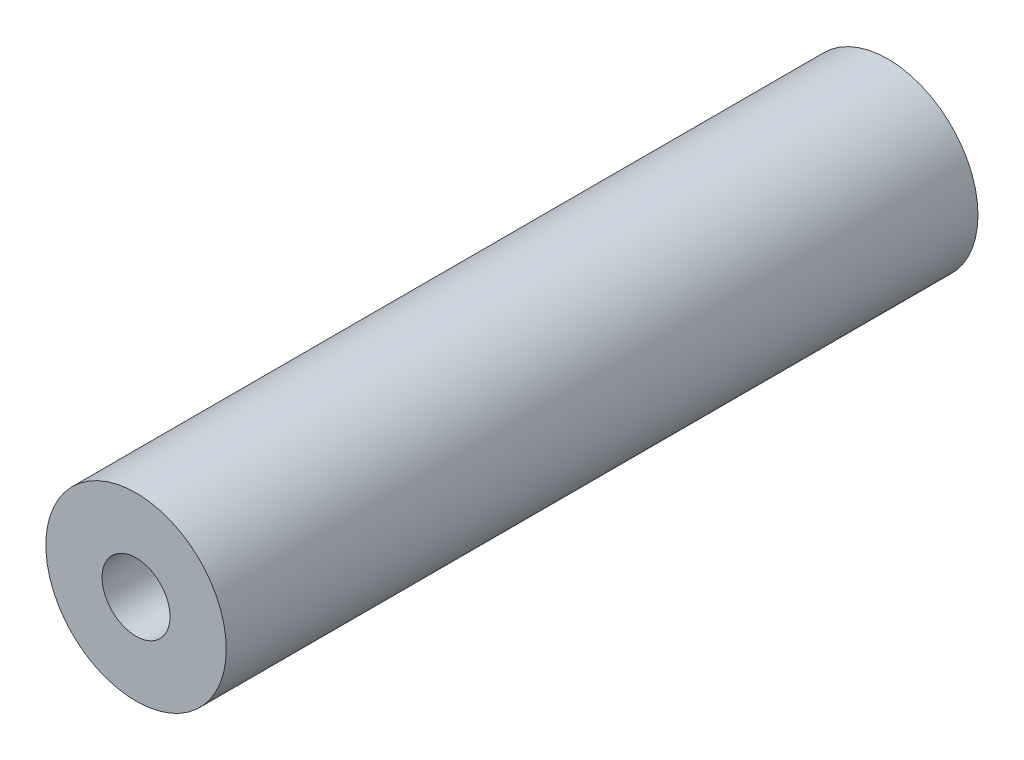
ISO-10303-21;
HEADER;
FILE_DESCRIPTION(('STEP AP214'),'2;1');
FILE_NAME('part.step','',(''),(''),'','','');
FILE_SCHEMA(('AUTOMOTIVE_DESIGN { 1 0 10303 214 1 1 1 1 }'));
ENDSEC;
DATA;
#1=APPLICATION_CONTEXT('core data for automotive mechanical design processes');
#2=APPLICATION_PROTOCOL_DEFINITION('international standard','automotive_design',2000,#1);
#3=PRODUCT_CONTEXT('',#1,'mechanical');
#4=PRODUCT('Part','Part','',(#3));
#5=PRODUCT_RELATED_PRODUCT_CATEGORY('part','',(#4));
#6=PRODUCT_DEFINITION_FORMATION('','',#4);
#7=PRODUCT_DEFINITION_CONTEXT('part definition',#1,'design');
#8=PRODUCT_DEFINITION('design','',#6,#7);
#9=PRODUCT_DEFINITION_SHAPE('','',#8);
#10=(LENGTH_UNIT() NAMED_UNIT(*) SI_UNIT(.MILLI.,.METRE.));
#11=(NAMED_UNIT(*) PLANE_ANGLE_UNIT() SI_UNIT($,.RADIAN.));
#12=(NAMED_UNIT(*) SI_UNIT($,.STERADIAN.) SOLID_ANGLE_UNIT());
#13=UNCERTAINTY_MEASURE_WITH_UNIT(LENGTH_MEASURE(1.E-05),#10,'distance_accuracy_value','');
#14=(GEOMETRIC_REPRESENTATION_CONTEXT(3) GLOBAL_UNCERTAINTY_ASSIGNED_CONTEXT((#13)) GLOBAL_UNIT_ASSIGNED_CONTEXT((#10,
#11,#12)) REPRESENTATION_CONTEXT('',''));
#15=CARTESIAN_POINT('',(0.,0.,0.));
#16=DIRECTION('',(0.,0.,1.));
#17=DIRECTION('',(1.,0.,0.));
#18=AXIS2_PLACEMENT_3D('',#15,#16,#17);
#19=CARTESIAN_POINT('',(0.,0.,250.));
#20=DIRECTION('',(0.,0.,1.));
#21=DIRECTION('',(1.,0.,0.));
#22=AXIS2_PLACEMENT_3D('',#19,#20,#21);
#23=PLANE('',#22);
#24=CARTESIAN_POINT('',(0.,0.,250.));
#25=DIRECTION('',(0.,0.,1.));
#26=DIRECTION('',(1.,0.,0.));
#27=AXIS2_PLACEMENT_3D('',#24,#25,#26);
#28=CIRCLE('',#27,30.);
#29=CARTESIAN_POINT('',(30.,0.,250.));
#30=VERTEX_POINT('',#29);
#31=EDGE_CURVE('E10',#30,#30,#28,.T.);
#32=ORIENTED_EDGE('',*,*,#31,.T.);
#33=EDGE_LOOP('',(#32));
#34=FACE_BOUND('',#33,.T.);
#35=CARTESIAN_POINT('',(0.,0.,250.));
#36=DIRECTION('',(0.,0.,1.));
#37=DIRECTION('',(1.,0.,0.));
#38=AXIS2_PLACEMENT_3D('',#35,#36,#37);
#39=CIRCLE('',#38,11.3);
#40=CARTESIAN_POINT('',(11.3,0.,250.));
#41=VERTEX_POINT('',#40);
#42=EDGE_CURVE('E42',#41,#41,#39,.T.);
#43=ORIENTED_EDGE('',*,*,#42,.F.);
#44=EDGE_LOOP('',(#43));
#45=FACE_BOUND('',#44,.T.);
#46=ADVANCED_FACE('F31',(#34,#45),#23,.T.);
#47=CARTESIAN_POINT('',(0.,0.,0.));
#48=DIRECTION('',(0.,0.,1.));
#49=DIRECTION('',(1.,0.,0.));
#50=AXIS2_PLACEMENT_3D('',#47,#48,#49);
#51=PLANE('',#50);
#52=CARTESIAN_POINT('',(0.,0.,0.));
#53=DIRECTION('',(0.,0.,1.));
#54=DIRECTION('',(1.,0.,0.));
#55=AXIS2_PLACEMENT_3D('',#52,#53,#54);
#56=CIRCLE('',#55,30.);
#57=CARTESIAN_POINT('',(30.,0.,0.));
#58=VERTEX_POINT('',#57);
#59=EDGE_CURVE('E35',#58,#58,#56,.T.);
#60=ORIENTED_EDGE('',*,*,#59,.F.);
#61=EDGE_LOOP('',(#60));
#62=FACE_BOUND('',#61,.T.);
#63=CARTESIAN_POINT('',(0.,0.,0.));
#64=DIRECTION('',(0.,0.,1.));
#65=DIRECTION('',(1.,0.,0.));
#66=AXIS2_PLACEMENT_3D('',#63,#64,#65);
#67=CIRCLE('',#66,11.3);
#68=CARTESIAN_POINT('',(11.3,0.,0.));
#69=VERTEX_POINT('',#68);
#70=EDGE_CURVE('E44',#69,#69,#67,.T.);
#71=ORIENTED_EDGE('',*,*,#70,.T.);
#72=EDGE_LOOP('',(#71));
#73=FACE_BOUND('',#72,.T.);
#74=ADVANCED_FACE('F54',(#62,#73),#51,.F.);
#75=CARTESIAN_POINT('',(0.,0.,250.));
#76=DIRECTION('',(0.,0.,-1.));
#77=DIRECTION('',(-1.,0.,0.));
#78=AXIS2_PLACEMENT_3D('',#75,#76,#77);
#79=CYLINDRICAL_SURFACE('',#78,30.);
#80=ORIENTED_EDGE('',*,*,#31,.F.);
#81=EDGE_LOOP('',(#80));
#82=FACE_BOUND('',#81,.T.);
#83=ORIENTED_EDGE('',*,*,#59,.T.);
#84=EDGE_LOOP('',(#83));
#85=FACE_BOUND('',#84,.T.);
#86=ADVANCED_FACE('F33',(#82,#85),#79,.T.);
#87=CARTESIAN_POINT('',(0.,0.,250.));
#88=DIRECTION('',(0.,0.,-1.));
#89=DIRECTION('',(-1.,0.,0.));
#90=AXIS2_PLACEMENT_3D('',#87,#88,#89);
#91=CYLINDRICAL_SURFACE('',#90,11.3);
#92=ORIENTED_EDGE('',*,*,#42,.T.);
#93=EDGE_LOOP('',(#92));
#94=FACE_BOUND('',#93,.T.);
#95=ORIENTED_EDGE('',*,*,#70,.F.);
#96=EDGE_LOOP('',(#95));
#97=FACE_BOUND('',#96,.T.);
#98=ADVANCED_FACE('F50',(#94,#97),#91,.F.);
#99=CLOSED_SHELL('',(#46,#74,#86,#98));
#100=MANIFOLD_SOLID_BREP('B2',#99);
#101=ADVANCED_BREP_SHAPE_REPRESENTATION('',(#18,#100),#14);
#102=SHAPE_DEFINITION_REPRESENTATION(#9,#101);
ENDSEC;
END-ISO-10303-21;
